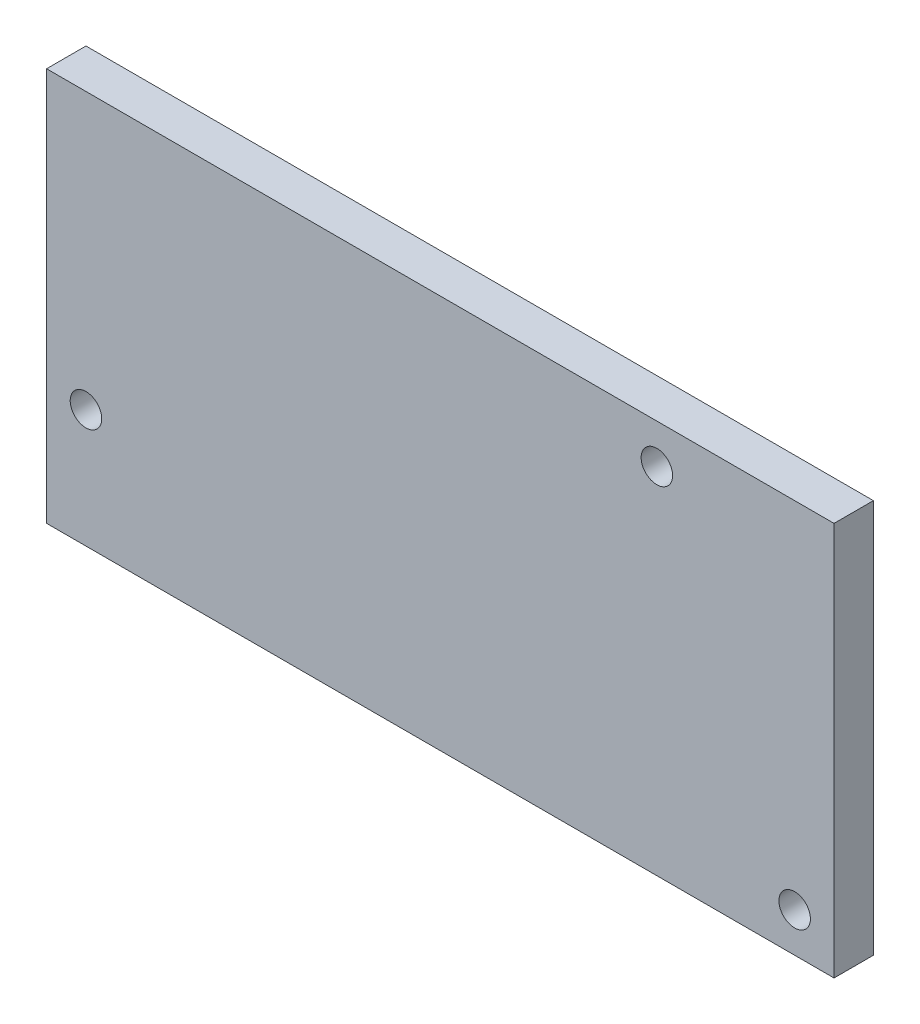
ISO-10303-21;
HEADER;
FILE_DESCRIPTION(('STEP AP214'),'2;1');
FILE_NAME('part.step','',(''),(''),'','','');
FILE_SCHEMA(('AUTOMOTIVE_DESIGN { 1 0 10303 214 1 1 1 1 }'));
ENDSEC;
DATA;
#1=APPLICATION_CONTEXT('core data for automotive mechanical design processes');
#2=APPLICATION_PROTOCOL_DEFINITION('international standard','automotive_design',2000,#1);
#3=PRODUCT_CONTEXT('',#1,'mechanical');
#4=PRODUCT('Part','Part','',(#3));
#5=PRODUCT_RELATED_PRODUCT_CATEGORY('part','',(#4));
#6=PRODUCT_DEFINITION_FORMATION('','',#4);
#7=PRODUCT_DEFINITION_CONTEXT('part definition',#1,'design');
#8=PRODUCT_DEFINITION('design','',#6,#7);
#9=PRODUCT_DEFINITION_SHAPE('','',#8);
#10=(LENGTH_UNIT() NAMED_UNIT(*) SI_UNIT(.MILLI.,.METRE.));
#11=(NAMED_UNIT(*) PLANE_ANGLE_UNIT() SI_UNIT($,.RADIAN.));
#12=(NAMED_UNIT(*) SI_UNIT($,.STERADIAN.) SOLID_ANGLE_UNIT());
#13=UNCERTAINTY_MEASURE_WITH_UNIT(LENGTH_MEASURE(1.E-05),#10,'distance_accuracy_value','');
#14=(GEOMETRIC_REPRESENTATION_CONTEXT(3) GLOBAL_UNCERTAINTY_ASSIGNED_CONTEXT((#13)) GLOBAL_UNIT_ASSIGNED_CONTEXT((#10,
#11,#12)) REPRESENTATION_CONTEXT('',''));
#15=CARTESIAN_POINT('',(0.,0.,0.));
#16=DIRECTION('',(0.,0.,1.));
#17=DIRECTION('',(1.,0.,0.));
#18=AXIS2_PLACEMENT_3D('',#15,#16,#17);
#19=CARTESIAN_POINT('',(0.,0.,10.));
#20=DIRECTION('',(0.,0.,-1.));
#21=DIRECTION('',(-1.,0.,0.));
#22=AXIS2_PLACEMENT_3D('',#19,#20,#21);
#23=PLANE('',#22);
#24=DIRECTION('',(0.,-1.,0.));
#25=VECTOR('',#24,1.);
#26=CARTESIAN_POINT('',(0.,0.,10.));
#27=LINE('',#26,#25);
#28=CARTESIAN_POINT('',(0.,100.,10.));
#29=VERTEX_POINT('',#28);
#30=CARTESIAN_POINT('',(0.,0.,10.));
#31=VERTEX_POINT('',#30);
#32=EDGE_CURVE('E85',#29,#31,#27,.T.);
#33=ORIENTED_EDGE('',*,*,#32,.T.);
#34=DIRECTION('',(1.,0.,0.));
#35=VECTOR('',#34,1.);
#36=CARTESIAN_POINT('',(0.,0.,10.));
#37=LINE('',#36,#35);
#38=CARTESIAN_POINT('',(200.,0.,10.));
#39=VERTEX_POINT('',#38);
#40=EDGE_CURVE('E80',#31,#39,#37,.T.);
#41=ORIENTED_EDGE('',*,*,#40,.T.);
#42=DIRECTION('',(0.,1.,0.));
#43=VECTOR('',#42,1.);
#44=CARTESIAN_POINT('',(200.,0.,10.));
#45=LINE('',#44,#43);
#46=CARTESIAN_POINT('',(200.,100.,10.));
#47=VERTEX_POINT('',#46);
#48=EDGE_CURVE('E83',#39,#47,#45,.T.);
#49=ORIENTED_EDGE('',*,*,#48,.T.);
#50=DIRECTION('',(-1.,0.,0.));
#51=VECTOR('',#50,1.);
#52=CARTESIAN_POINT('',(0.,100.,10.));
#53=LINE('',#52,#51);
#54=EDGE_CURVE('E50',#47,#29,#53,.T.);
#55=ORIENTED_EDGE('',*,*,#54,.T.);
#56=EDGE_LOOP('',(#33,#41,#49,#55));
#57=FACE_BOUND('',#56,.T.);
#58=CARTESIAN_POINT('',(10.,30.,10.));
#59=DIRECTION('',(0.,0.,1.));
#60=DIRECTION('',(1.,0.,0.));
#61=AXIS2_PLACEMENT_3D('',#58,#59,#60);
#62=CIRCLE('',#61,4.);
#63=CARTESIAN_POINT('',(14.,30.,10.));
#64=VERTEX_POINT('',#63);
#65=EDGE_CURVE('E100',#64,#64,#62,.T.);
#66=ORIENTED_EDGE('',*,*,#65,.F.);
#67=EDGE_LOOP('',(#66));
#68=FACE_BOUND('',#67,.T.);
#69=CARTESIAN_POINT('',(190.,10.,10.));
#70=DIRECTION('',(0.,0.,1.));
#71=DIRECTION('',(1.,0.,0.));
#72=AXIS2_PLACEMENT_3D('',#69,#70,#71);
#73=CIRCLE('',#72,3.99999999999999);
#74=CARTESIAN_POINT('',(194.,10.,10.));
#75=VERTEX_POINT('',#74);
#76=EDGE_CURVE('E115',#75,#75,#73,.T.);
#77=ORIENTED_EDGE('',*,*,#76,.F.);
#78=EDGE_LOOP('',(#77));
#79=FACE_BOUND('',#78,.T.);
#80=CARTESIAN_POINT('',(155.,90.,10.));
#81=DIRECTION('',(0.,0.,1.));
#82=DIRECTION('',(1.,0.,0.));
#83=AXIS2_PLACEMENT_3D('',#80,#81,#82);
#84=CIRCLE('',#83,3.99999999999999);
#85=CARTESIAN_POINT('',(159.,90.,10.));
#86=VERTEX_POINT('',#85);
#87=EDGE_CURVE('E121',#86,#86,#84,.T.);
#88=ORIENTED_EDGE('',*,*,#87,.F.);
#89=EDGE_LOOP('',(#88));
#90=FACE_BOUND('',#89,.T.);
#91=ADVANCED_FACE('F33',(#57,#68,#79,#90),#23,.F.);
#92=CARTESIAN_POINT('',(0.,0.,0.));
#93=DIRECTION('',(0.,0.,-1.));
#94=DIRECTION('',(-1.,0.,0.));
#95=AXIS2_PLACEMENT_3D('',#92,#93,#94);
#96=PLANE('',#95);
#97=CARTESIAN_POINT('',(190.,10.,0.));
#98=DIRECTION('',(0.,0.,1.));
#99=DIRECTION('',(1.,0.,0.));
#100=AXIS2_PLACEMENT_3D('',#97,#98,#99);
#101=CIRCLE('',#100,3.99999999999999);
#102=CARTESIAN_POINT('',(194.,10.,0.));
#103=VERTEX_POINT('',#102);
#104=EDGE_CURVE('E118',#103,#103,#101,.T.);
#105=ORIENTED_EDGE('',*,*,#104,.T.);
#106=EDGE_LOOP('',(#105));
#107=FACE_BOUND('',#106,.T.);
#108=DIRECTION('',(0.,-1.,0.));
#109=VECTOR('',#108,1.);
#110=CARTESIAN_POINT('',(0.,0.,0.));
#111=LINE('',#110,#109);
#112=CARTESIAN_POINT('',(0.,100.,0.));
#113=VERTEX_POINT('',#112);
#114=CARTESIAN_POINT('',(0.,0.,0.));
#115=VERTEX_POINT('',#114);
#116=EDGE_CURVE('E97',#113,#115,#111,.T.);
#117=ORIENTED_EDGE('',*,*,#116,.F.);
#118=DIRECTION('',(-1.,0.,0.));
#119=VECTOR('',#118,1.);
#120=CARTESIAN_POINT('',(0.,100.,0.));
#121=LINE('',#120,#119);
#122=CARTESIAN_POINT('',(200.,100.,0.));
#123=VERTEX_POINT('',#122);
#124=EDGE_CURVE('E73',#123,#113,#121,.T.);
#125=ORIENTED_EDGE('',*,*,#124,.F.);
#126=DIRECTION('',(0.,1.,0.));
#127=VECTOR('',#126,1.);
#128=CARTESIAN_POINT('',(200.,0.,0.));
#129=LINE('',#128,#127);
#130=CARTESIAN_POINT('',(200.,0.,0.));
#131=VERTEX_POINT('',#130);
#132=EDGE_CURVE('E67',#131,#123,#129,.T.);
#133=ORIENTED_EDGE('',*,*,#132,.F.);
#134=DIRECTION('',(1.,0.,0.));
#135=VECTOR('',#134,1.);
#136=CARTESIAN_POINT('',(0.,0.,0.));
#137=LINE('',#136,#135);
#138=EDGE_CURVE('E89',#115,#131,#137,.T.);
#139=ORIENTED_EDGE('',*,*,#138,.F.);
#140=EDGE_LOOP('',(#117,#125,#133,#139));
#141=FACE_BOUND('',#140,.T.);
#142=CARTESIAN_POINT('',(10.,30.,0.));
#143=DIRECTION('',(0.,0.,1.));
#144=DIRECTION('',(1.,0.,0.));
#145=AXIS2_PLACEMENT_3D('',#142,#143,#144);
#146=CIRCLE('',#145,4.);
#147=CARTESIAN_POINT('',(14.,30.,0.));
#148=VERTEX_POINT('',#147);
#149=EDGE_CURVE('E112',#148,#148,#146,.T.);
#150=ORIENTED_EDGE('',*,*,#149,.T.);
#151=EDGE_LOOP('',(#150));
#152=FACE_BOUND('',#151,.T.);
#153=CARTESIAN_POINT('',(155.,90.,0.));
#154=DIRECTION('',(0.,0.,1.));
#155=DIRECTION('',(1.,0.,0.));
#156=AXIS2_PLACEMENT_3D('',#153,#154,#155);
#157=CIRCLE('',#156,3.99999999999999);
#158=CARTESIAN_POINT('',(159.,90.,0.));
#159=VERTEX_POINT('',#158);
#160=EDGE_CURVE('E124',#159,#159,#157,.T.);
#161=ORIENTED_EDGE('',*,*,#160,.T.);
#162=EDGE_LOOP('',(#161));
#163=FACE_BOUND('',#162,.T.);
#164=ADVANCED_FACE('F108',(#107,#141,#152,#163),#96,.T.);
#165=CARTESIAN_POINT('',(0.,0.,10.));
#166=DIRECTION('',(1.,0.,0.));
#167=DIRECTION('',(0.,0.,-1.));
#168=AXIS2_PLACEMENT_3D('',#165,#166,#167);
#169=PLANE('',#168);
#170=ORIENTED_EDGE('',*,*,#116,.T.);
#171=DIRECTION('',(0.,0.,-1.));
#172=VECTOR('',#171,1.);
#173=CARTESIAN_POINT('',(0.,0.,10.));
#174=LINE('',#173,#172);
#175=EDGE_CURVE('E11',#31,#115,#174,.T.);
#176=ORIENTED_EDGE('',*,*,#175,.F.);
#177=ORIENTED_EDGE('',*,*,#32,.F.);
#178=DIRECTION('',(0.,0.,-1.));
#179=VECTOR('',#178,1.);
#180=CARTESIAN_POINT('',(0.,100.,10.));
#181=LINE('',#180,#179);
#182=EDGE_CURVE('E93',#29,#113,#181,.T.);
#183=ORIENTED_EDGE('',*,*,#182,.T.);
#184=EDGE_LOOP('',(#170,#176,#177,#183));
#185=FACE_BOUND('',#184,.T.);
#186=ADVANCED_FACE('F35',(#185),#169,.F.);
#187=CARTESIAN_POINT('',(0.,0.,10.));
#188=DIRECTION('',(0.,1.,0.));
#189=DIRECTION('',(0.,0.,1.));
#190=AXIS2_PLACEMENT_3D('',#187,#188,#189);
#191=PLANE('',#190);
#192=ORIENTED_EDGE('',*,*,#138,.T.);
#193=DIRECTION('',(0.,0.,-1.));
#194=VECTOR('',#193,1.);
#195=CARTESIAN_POINT('',(200.,0.,10.));
#196=LINE('',#195,#194);
#197=EDGE_CURVE('E42',#39,#131,#196,.T.);
#198=ORIENTED_EDGE('',*,*,#197,.F.);
#199=ORIENTED_EDGE('',*,*,#40,.F.);
#200=ORIENTED_EDGE('',*,*,#175,.T.);
#201=EDGE_LOOP('',(#192,#198,#199,#200));
#202=FACE_BOUND('',#201,.T.);
#203=ADVANCED_FACE('F88',(#202),#191,.F.);
#204=CARTESIAN_POINT('',(200.,0.,10.));
#205=DIRECTION('',(-1.,0.,0.));
#206=DIRECTION('',(0.,0.,1.));
#207=AXIS2_PLACEMENT_3D('',#204,#205,#206);
#208=PLANE('',#207);
#209=ORIENTED_EDGE('',*,*,#132,.T.);
#210=DIRECTION('',(0.,0.,-1.));
#211=VECTOR('',#210,1.);
#212=CARTESIAN_POINT('',(200.,100.,10.));
#213=LINE('',#212,#211);
#214=EDGE_CURVE('E90',#47,#123,#213,.T.);
#215=ORIENTED_EDGE('',*,*,#214,.F.);
#216=ORIENTED_EDGE('',*,*,#48,.F.);
#217=ORIENTED_EDGE('',*,*,#197,.T.);
#218=EDGE_LOOP('',(#209,#215,#216,#217));
#219=FACE_BOUND('',#218,.T.);
#220=ADVANCED_FACE('F91',(#219),#208,.F.);
#221=CARTESIAN_POINT('',(0.,100.,10.));
#222=DIRECTION('',(0.,-1.,0.));
#223=DIRECTION('',(0.,0.,-1.));
#224=AXIS2_PLACEMENT_3D('',#221,#222,#223);
#225=PLANE('',#224);
#226=ORIENTED_EDGE('',*,*,#124,.T.);
#227=ORIENTED_EDGE('',*,*,#182,.F.);
#228=ORIENTED_EDGE('',*,*,#54,.F.);
#229=ORIENTED_EDGE('',*,*,#214,.T.);
#230=EDGE_LOOP('',(#226,#227,#228,#229));
#231=FACE_BOUND('',#230,.T.);
#232=ADVANCED_FACE('F105',(#231),#225,.F.);
#233=CARTESIAN_POINT('',(10.,30.,10.));
#234=DIRECTION('',(0.,0.,-1.));
#235=DIRECTION('',(-1.,0.,0.));
#236=AXIS2_PLACEMENT_3D('',#233,#234,#235);
#237=CYLINDRICAL_SURFACE('',#236,4.);
#238=ORIENTED_EDGE('',*,*,#65,.T.);
#239=EDGE_LOOP('',(#238));
#240=FACE_BOUND('',#239,.T.);
#241=ORIENTED_EDGE('',*,*,#149,.F.);
#242=EDGE_LOOP('',(#241));
#243=FACE_BOUND('',#242,.T.);
#244=ADVANCED_FACE('F141',(#240,#243),#237,.F.);
#245=CARTESIAN_POINT('',(190.,10.,10.));
#246=DIRECTION('',(0.,0.,-1.));
#247=DIRECTION('',(-1.,0.,0.));
#248=AXIS2_PLACEMENT_3D('',#245,#246,#247);
#249=CYLINDRICAL_SURFACE('',#248,3.99999999999999);
#250=ORIENTED_EDGE('',*,*,#76,.T.);
#251=EDGE_LOOP('',(#250));
#252=FACE_BOUND('',#251,.T.);
#253=ORIENTED_EDGE('',*,*,#104,.F.);
#254=EDGE_LOOP('',(#253));
#255=FACE_BOUND('',#254,.T.);
#256=ADVANCED_FACE('F187',(#252,#255),#249,.F.);
#257=CARTESIAN_POINT('',(155.,90.,10.));
#258=DIRECTION('',(0.,0.,-1.));
#259=DIRECTION('',(-1.,0.,0.));
#260=AXIS2_PLACEMENT_3D('',#257,#258,#259);
#261=CYLINDRICAL_SURFACE('',#260,3.99999999999999);
#262=ORIENTED_EDGE('',*,*,#87,.T.);
#263=EDGE_LOOP('',(#262));
#264=FACE_BOUND('',#263,.T.);
#265=ORIENTED_EDGE('',*,*,#160,.F.);
#266=EDGE_LOOP('',(#265));
#267=FACE_BOUND('',#266,.T.);
#268=ADVANCED_FACE('F130',(#264,#267),#261,.F.);
#269=CLOSED_SHELL('',(#91,#164,#186,#203,#220,#232,#244,#256,#268));
#270=MANIFOLD_SOLID_BREP('B2',#269);
#271=ADVANCED_BREP_SHAPE_REPRESENTATION('',(#18,#270),#14);
#272=SHAPE_DEFINITION_REPRESENTATION(#9,#271);
ENDSEC;
END-ISO-10303-21;
